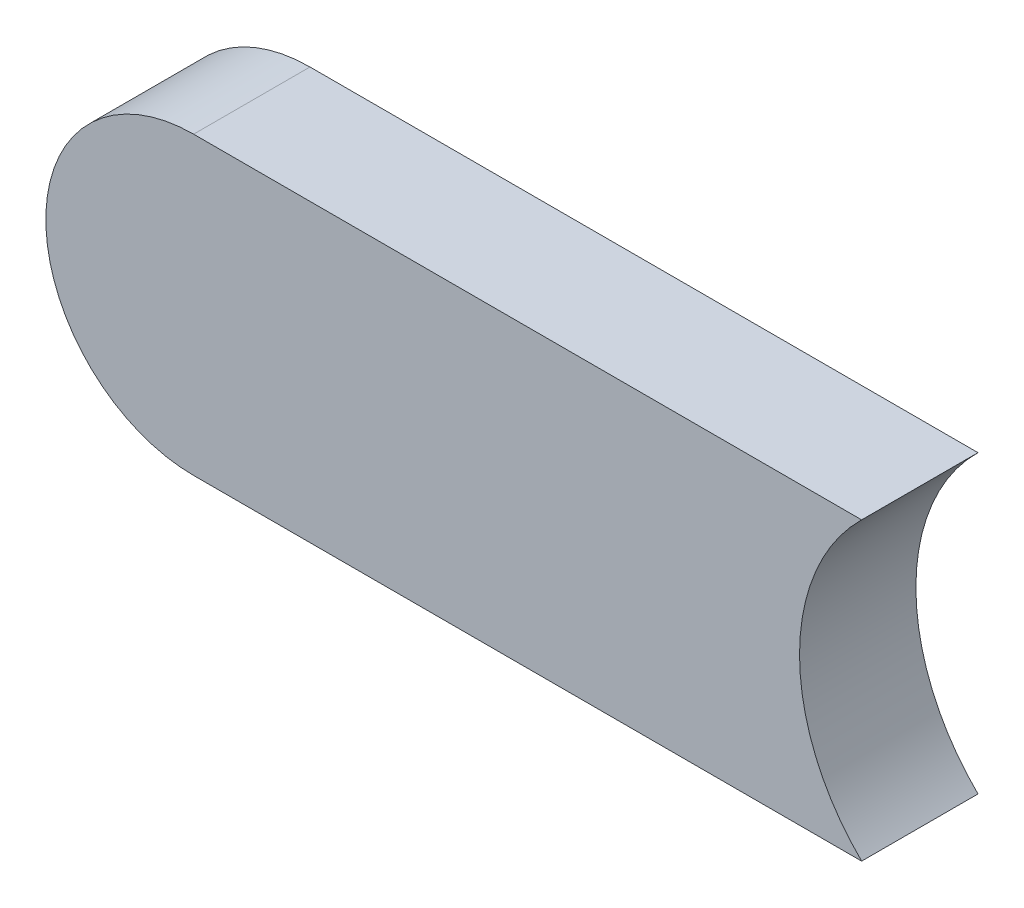
ISO-10303-21;
HEADER;
FILE_DESCRIPTION(('STEP AP214'),'2;1');
FILE_NAME('part.step','',(''),(''),'','','');
FILE_SCHEMA(('AUTOMOTIVE_DESIGN { 1 0 10303 214 1 1 1 1 }'));
ENDSEC;
DATA;
#1=APPLICATION_CONTEXT('core data for automotive mechanical design processes');
#2=APPLICATION_PROTOCOL_DEFINITION('international standard','automotive_design',2000,#1);
#3=PRODUCT_CONTEXT('',#1,'mechanical');
#4=PRODUCT('Part','Part','',(#3));
#5=PRODUCT_RELATED_PRODUCT_CATEGORY('part','',(#4));
#6=PRODUCT_DEFINITION_FORMATION('','',#4);
#7=PRODUCT_DEFINITION_CONTEXT('part definition',#1,'design');
#8=PRODUCT_DEFINITION('design','',#6,#7);
#9=PRODUCT_DEFINITION_SHAPE('','',#8);
#10=(LENGTH_UNIT() NAMED_UNIT(*) SI_UNIT(.MILLI.,.METRE.));
#11=(NAMED_UNIT(*) PLANE_ANGLE_UNIT() SI_UNIT($,.RADIAN.));
#12=(NAMED_UNIT(*) SI_UNIT($,.STERADIAN.) SOLID_ANGLE_UNIT());
#13=UNCERTAINTY_MEASURE_WITH_UNIT(LENGTH_MEASURE(1.E-05),#10,'distance_accuracy_value','');
#14=(GEOMETRIC_REPRESENTATION_CONTEXT(3) GLOBAL_UNCERTAINTY_ASSIGNED_CONTEXT((#13)) GLOBAL_UNIT_ASSIGNED_CONTEXT((#10,
#11,#12)) REPRESENTATION_CONTEXT('',''));
#15=CARTESIAN_POINT('',(0.,0.,0.));
#16=DIRECTION('',(0.,0.,1.));
#17=DIRECTION('',(1.,0.,0.));
#18=AXIS2_PLACEMENT_3D('',#15,#16,#17);
#19=CARTESIAN_POINT('',(90.932,50.927,0.));
#20=DIRECTION('',(0.,1.,0.));
#21=DIRECTION('',(1.,0.,0.));
#22=AXIS2_PLACEMENT_3D('',#19,#20,#21);
#23=PLANE('',#22);
#24=DIRECTION('',(1.,0.,0.));
#25=VECTOR('',#24,1.);
#26=CARTESIAN_POINT('',(90.932,50.927,0.1999996));
#27=LINE('',#26,#25);
#28=CARTESIAN_POINT('',(90.932,50.927,0.1999996));
#29=VERTEX_POINT('',#28);
#30=CARTESIAN_POINT('',(92.0801318421332,50.927,0.1999996));
#31=VERTEX_POINT('',#30);
#32=EDGE_CURVE('E11',#29,#31,#27,.T.);
#33=ORIENTED_EDGE('',*,*,#32,.F.);
#34=DIRECTION('',(0.,0.,1.));
#35=VECTOR('',#34,1.);
#36=CARTESIAN_POINT('',(90.932,50.927,0.));
#37=LINE('',#36,#35);
#38=CARTESIAN_POINT('',(90.932,50.927,0.));
#39=VERTEX_POINT('',#38);
#40=EDGE_CURVE('E24',#39,#29,#37,.T.);
#41=ORIENTED_EDGE('',*,*,#40,.F.);
#42=DIRECTION('',(1.,0.,0.));
#43=VECTOR('',#42,1.);
#44=CARTESIAN_POINT('',(90.932,50.927,0.));
#45=LINE('',#44,#43);
#46=CARTESIAN_POINT('',(92.0801318421332,50.927,0.));
#47=VERTEX_POINT('',#46);
#48=EDGE_CURVE('E75',#39,#47,#45,.T.);
#49=ORIENTED_EDGE('',*,*,#48,.T.);
#50=DIRECTION('',(0.,0.,1.));
#51=VECTOR('',#50,1.);
#52=CARTESIAN_POINT('',(92.0801318421332,50.927,0.));
#53=LINE('',#52,#51);
#54=EDGE_CURVE('E37',#47,#31,#53,.T.);
#55=ORIENTED_EDGE('',*,*,#54,.T.);
#56=EDGE_LOOP('',(#33,#41,#49,#55));
#57=FACE_BOUND('',#56,.T.);
#58=ADVANCED_FACE('F17',(#57),#23,.F.);
#59=CARTESIAN_POINT('',(92.329,51.181,0.));
#60=DIRECTION('',(0.,0.,-1.));
#61=DIRECTION('',(1.,0.,0.));
#62=AXIS2_PLACEMENT_3D('',#59,#60,#61);
#63=CYLINDRICAL_SURFACE('',#62,0.3556);
#64=DIRECTION('',(0.,0.,1.));
#65=VECTOR('',#64,1.);
#66=CARTESIAN_POINT('',(92.0801318421332,51.435,0.));
#67=LINE('',#66,#65);
#68=CARTESIAN_POINT('',(92.0801318421332,51.435,0.));
#69=VERTEX_POINT('',#68);
#70=CARTESIAN_POINT('',(92.0801318421332,51.435,0.1999996));
#71=VERTEX_POINT('',#70);
#72=EDGE_CURVE('E67',#69,#71,#67,.T.);
#73=ORIENTED_EDGE('',*,*,#72,.T.);
#74=CARTESIAN_POINT('',(92.329,51.181,0.1999996));
#75=DIRECTION('',(0.,0.,1.));
#76=DIRECTION('',(1.,0.,0.));
#77=AXIS2_PLACEMENT_3D('',#74,#75,#76);
#78=CIRCLE('',#77,0.3556);
#79=EDGE_CURVE('E82',#71,#31,#78,.T.);
#80=ORIENTED_EDGE('',*,*,#79,.T.);
#81=ORIENTED_EDGE('',*,*,#54,.F.);
#82=CARTESIAN_POINT('',(92.329,51.181,0.));
#83=DIRECTION('',(0.,0.,1.));
#84=DIRECTION('',(1.,0.,0.));
#85=AXIS2_PLACEMENT_3D('',#82,#83,#84);
#86=CIRCLE('',#85,0.3556);
#87=EDGE_CURVE('E80',#69,#47,#86,.T.);
#88=ORIENTED_EDGE('',*,*,#87,.F.);
#89=EDGE_LOOP('',(#73,#80,#81,#88));
#90=FACE_BOUND('',#89,.T.);
#91=ADVANCED_FACE('F88',(#90),#63,.F.);
#92=CARTESIAN_POINT('',(92.0801318421332,51.435,0.));
#93=DIRECTION('',(0.,-1.,0.));
#94=DIRECTION('',(-1.,0.,0.));
#95=AXIS2_PLACEMENT_3D('',#92,#93,#94);
#96=PLANE('',#95);
#97=DIRECTION('',(-1.,0.,0.));
#98=VECTOR('',#97,1.);
#99=CARTESIAN_POINT('',(92.329,51.435,0.1999996));
#100=LINE('',#99,#98);
#101=CARTESIAN_POINT('',(90.932,51.435,0.1999996));
#102=VERTEX_POINT('',#101);
#103=EDGE_CURVE('E71',#71,#102,#100,.T.);
#104=ORIENTED_EDGE('',*,*,#103,.F.);
#105=ORIENTED_EDGE('',*,*,#72,.F.);
#106=DIRECTION('',(-1.,0.,0.));
#107=VECTOR('',#106,1.);
#108=CARTESIAN_POINT('',(92.329,51.435,0.));
#109=LINE('',#108,#107);
#110=CARTESIAN_POINT('',(90.932,51.435,0.));
#111=VERTEX_POINT('',#110);
#112=EDGE_CURVE('E63',#69,#111,#109,.T.);
#113=ORIENTED_EDGE('',*,*,#112,.T.);
#114=DIRECTION('',(0.,0.,1.));
#115=VECTOR('',#114,1.);
#116=CARTESIAN_POINT('',(90.932,51.435,0.));
#117=LINE('',#116,#115);
#118=EDGE_CURVE('E53',#111,#102,#117,.T.);
#119=ORIENTED_EDGE('',*,*,#118,.T.);
#120=EDGE_LOOP('',(#104,#105,#113,#119));
#121=FACE_BOUND('',#120,.T.);
#122=ADVANCED_FACE('F66',(#121),#96,.F.);
#123=CARTESIAN_POINT('',(90.932,51.181,0.));
#124=DIRECTION('',(0.,0.,-1.));
#125=DIRECTION('',(0.,1.,0.));
#126=AXIS2_PLACEMENT_3D('',#123,#124,#125);
#127=CYLINDRICAL_SURFACE('',#126,0.254000000000003);
#128=CARTESIAN_POINT('',(90.932,51.181,0.1999996));
#129=DIRECTION('',(0.,0.,1.));
#130=DIRECTION('',(0.,1.,0.));
#131=AXIS2_PLACEMENT_3D('',#128,#129,#130);
#132=CIRCLE('',#131,0.254000000000003);
#133=EDGE_CURVE('E59',#102,#29,#132,.T.);
#134=ORIENTED_EDGE('',*,*,#133,.F.);
#135=ORIENTED_EDGE('',*,*,#118,.F.);
#136=CARTESIAN_POINT('',(90.932,51.181,0.));
#137=DIRECTION('',(0.,0.,1.));
#138=DIRECTION('',(0.,1.,0.));
#139=AXIS2_PLACEMENT_3D('',#136,#137,#138);
#140=CIRCLE('',#139,0.254000000000003);
#141=EDGE_CURVE('E57',#111,#39,#140,.T.);
#142=ORIENTED_EDGE('',*,*,#141,.T.);
#143=ORIENTED_EDGE('',*,*,#40,.T.);
#144=EDGE_LOOP('',(#134,#135,#142,#143));
#145=FACE_BOUND('',#144,.T.);
#146=ADVANCED_FACE('F55',(#145),#127,.T.);
#147=CARTESIAN_POINT('',(90.932,50.927,0.));
#148=DIRECTION('',(0.,0.,-1.));
#149=DIRECTION('',(-1.,0.,0.));
#150=AXIS2_PLACEMENT_3D('',#147,#148,#149);
#151=PLANE('',#150);
#152=ORIENTED_EDGE('',*,*,#48,.F.);
#153=ORIENTED_EDGE('',*,*,#141,.F.);
#154=ORIENTED_EDGE('',*,*,#112,.F.);
#155=ORIENTED_EDGE('',*,*,#87,.T.);
#156=EDGE_LOOP('',(#152,#153,#154,#155));
#157=FACE_BOUND('',#156,.T.);
#158=ADVANCED_FACE('F74',(#157),#151,.T.);
#159=CARTESIAN_POINT('',(90.932,50.927,0.1999996));
#160=DIRECTION('',(0.,0.,-1.));
#161=DIRECTION('',(-1.,0.,0.));
#162=AXIS2_PLACEMENT_3D('',#159,#160,#161);
#163=PLANE('',#162);
#164=ORIENTED_EDGE('',*,*,#133,.T.);
#165=ORIENTED_EDGE('',*,*,#32,.T.);
#166=ORIENTED_EDGE('',*,*,#79,.F.);
#167=ORIENTED_EDGE('',*,*,#103,.T.);
#168=EDGE_LOOP('',(#164,#165,#166,#167));
#169=FACE_BOUND('',#168,.T.);
#170=ADVANCED_FACE('F91',(#169),#163,.F.);
#171=CLOSED_SHELL('',(#58,#91,#122,#146,#158,#170));
#172=MANIFOLD_SOLID_BREP('B1',#171);
#173=ADVANCED_BREP_SHAPE_REPRESENTATION('',(#18,#172),#14);
#174=SHAPE_DEFINITION_REPRESENTATION(#9,#173);
ENDSEC;
END-ISO-10303-21;
